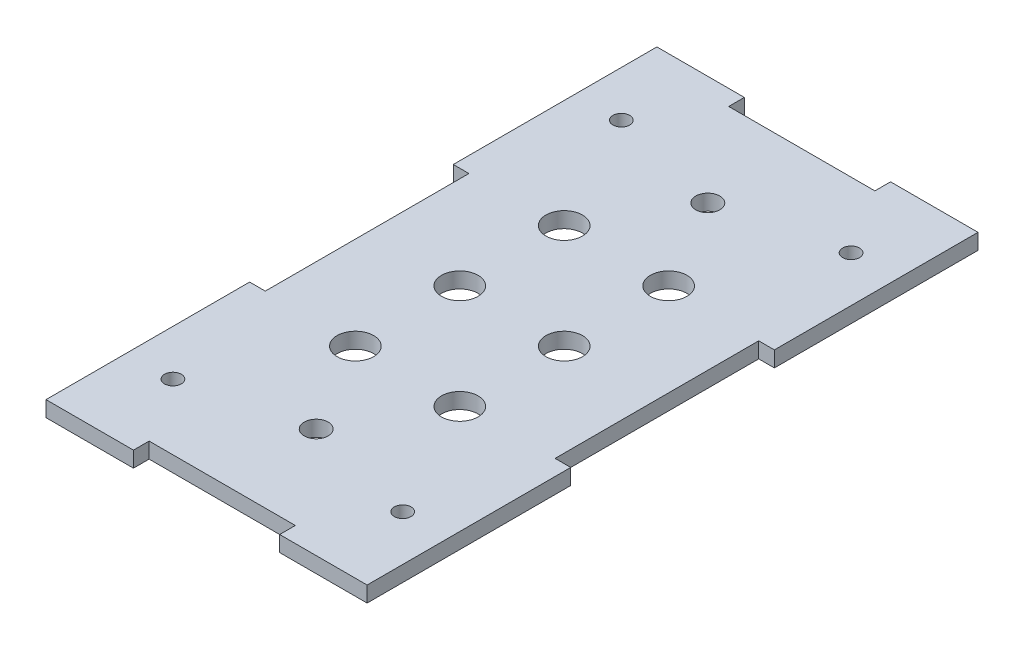
ISO-10303-21;
HEADER;
FILE_DESCRIPTION(('STEP AP214'),'2;1');
FILE_NAME('part.step','',(''),(''),'','','');
FILE_SCHEMA(('AUTOMOTIVE_DESIGN { 1 0 10303 214 1 1 1 1 }'));
ENDSEC;
DATA;
#1=APPLICATION_CONTEXT('core data for automotive mechanical design processes');
#2=APPLICATION_PROTOCOL_DEFINITION('international standard','automotive_design',2000,#1);
#3=PRODUCT_CONTEXT('',#1,'mechanical');
#4=PRODUCT('Part','Part','',(#3));
#5=PRODUCT_RELATED_PRODUCT_CATEGORY('part','',(#4));
#6=PRODUCT_DEFINITION_FORMATION('','',#4);
#7=PRODUCT_DEFINITION_CONTEXT('part definition',#1,'design');
#8=PRODUCT_DEFINITION('design','',#6,#7);
#9=PRODUCT_DEFINITION_SHAPE('','',#8);
#10=(LENGTH_UNIT() NAMED_UNIT(*) SI_UNIT(.MILLI.,.METRE.));
#11=(NAMED_UNIT(*) PLANE_ANGLE_UNIT() SI_UNIT($,.RADIAN.));
#12=(NAMED_UNIT(*) SI_UNIT($,.STERADIAN.) SOLID_ANGLE_UNIT());
#13=UNCERTAINTY_MEASURE_WITH_UNIT(LENGTH_MEASURE(1.E-05),#10,'distance_accuracy_value','');
#14=(GEOMETRIC_REPRESENTATION_CONTEXT(3) GLOBAL_UNCERTAINTY_ASSIGNED_CONTEXT((#13)) GLOBAL_UNIT_ASSIGNED_CONTEXT((#10,
#11,#12)) REPRESENTATION_CONTEXT('',''));
#15=CARTESIAN_POINT('',(0.,0.,0.));
#16=DIRECTION('',(0.,0.,1.));
#17=DIRECTION('',(1.,0.,0.));
#18=AXIS2_PLACEMENT_3D('',#15,#16,#17);
#19=CARTESIAN_POINT('',(0.,3.,0.));
#20=DIRECTION('',(0.,1.,0.));
#21=DIRECTION('',(0.,0.,1.));
#22=AXIS2_PLACEMENT_3D('',#19,#20,#21);
#23=PLANE('',#22);
#24=CARTESIAN_POINT('',(-10.0000000000001,3.,-20.));
#25=DIRECTION('',(0.,1.,0.));
#26=DIRECTION('',(0.,0.,1.));
#27=AXIS2_PLACEMENT_3D('',#24,#25,#26);
#28=CIRCLE('',#27,3.5);
#29=CARTESIAN_POINT('',(-10.0000000000001,3.,-16.5));
#30=VERTEX_POINT('',#29);
#31=EDGE_CURVE('E427',#30,#30,#28,.T.);
#32=ORIENTED_EDGE('',*,*,#31,.F.);
#33=EDGE_LOOP('',(#32));
#34=FACE_BOUND('',#33,.T.);
#35=CARTESIAN_POINT('',(-10.,3.,0.));
#36=DIRECTION('',(0.,1.,0.));
#37=DIRECTION('',(0.,0.,1.));
#38=AXIS2_PLACEMENT_3D('',#35,#36,#37);
#39=CIRCLE('',#38,3.5);
#40=CARTESIAN_POINT('',(-10.,3.,3.5));
#41=VERTEX_POINT('',#40);
#42=EDGE_CURVE('E439',#41,#41,#39,.T.);
#43=ORIENTED_EDGE('',*,*,#42,.F.);
#44=EDGE_LOOP('',(#43));
#45=FACE_BOUND('',#44,.T.);
#46=CARTESIAN_POINT('',(-9.99999999999979,3.,20.));
#47=DIRECTION('',(0.,1.,0.));
#48=DIRECTION('',(0.,0.,1.));
#49=AXIS2_PLACEMENT_3D('',#46,#47,#48);
#50=CIRCLE('',#49,3.5);
#51=CARTESIAN_POINT('',(-9.99999999999979,3.,23.5));
#52=VERTEX_POINT('',#51);
#53=EDGE_CURVE('E451',#52,#52,#50,.T.);
#54=ORIENTED_EDGE('',*,*,#53,.F.);
#55=EDGE_LOOP('',(#54));
#56=FACE_BOUND('',#55,.T.);
#57=CARTESIAN_POINT('',(22.,3.,-42.94));
#58=DIRECTION('',(0.,1.,0.));
#59=DIRECTION('',(0.,0.,1.));
#60=AXIS2_PLACEMENT_3D('',#57,#58,#59);
#61=CIRCLE('',#60,1.60920482237498);
#62=CARTESIAN_POINT('',(22.,3.,-41.330795177625));
#63=VERTEX_POINT('',#62);
#64=EDGE_CURVE('E463',#63,#63,#61,.T.);
#65=ORIENTED_EDGE('',*,*,#64,.F.);
#66=EDGE_LOOP('',(#65));
#67=FACE_BOUND('',#66,.T.);
#68=CARTESIAN_POINT('',(-22.,3.,42.94));
#69=DIRECTION('',(0.,1.,0.));
#70=DIRECTION('',(0.,0.,1.));
#71=AXIS2_PLACEMENT_3D('',#68,#69,#70);
#72=CIRCLE('',#71,1.60920482237498);
#73=CARTESIAN_POINT('',(-22.,3.,44.549204822375));
#74=VERTEX_POINT('',#73);
#75=EDGE_CURVE('E475',#74,#74,#72,.T.);
#76=ORIENTED_EDGE('',*,*,#75,.F.);
#77=EDGE_LOOP('',(#76));
#78=FACE_BOUND('',#77,.T.);
#79=CARTESIAN_POINT('',(0.,3.,-37.5));
#80=DIRECTION('',(0.,1.,0.));
#81=DIRECTION('',(0.,0.,1.));
#82=AXIS2_PLACEMENT_3D('',#79,#80,#81);
#83=CIRCLE('',#82,2.3);
#84=CARTESIAN_POINT('',(0.,3.,-35.2));
#85=VERTEX_POINT('',#84);
#86=EDGE_CURVE('E206',#85,#85,#83,.T.);
#87=ORIENTED_EDGE('',*,*,#86,.F.);
#88=EDGE_LOOP('',(#87));
#89=FACE_BOUND('',#88,.T.);
#90=DIRECTION('',(-1.,0.,0.));
#91=VECTOR('',#90,1.);
#92=CARTESIAN_POINT('',(30.7499999999994,3.,-58.5000000000003));
#93=LINE('',#92,#91);
#94=CARTESIAN_POINT('',(30.7499999999994,3.,-58.5000000000003));
#95=VERTEX_POINT('',#94);
#96=CARTESIAN_POINT('',(13.9999999999994,3.,-58.5000000000001));
#97=VERTEX_POINT('',#96);
#98=EDGE_CURVE('E241',#95,#97,#93,.T.);
#99=ORIENTED_EDGE('',*,*,#98,.T.);
#100=DIRECTION('',(0.,0.,1.));
#101=VECTOR('',#100,1.);
#102=CARTESIAN_POINT('',(13.9999999999994,3.,-58.5000000000001));
#103=LINE('',#102,#101);
#104=CARTESIAN_POINT('',(13.9999999999994,3.,-55.5000000000001));
#105=VERTEX_POINT('',#104);
#106=EDGE_CURVE('E129',#97,#105,#103,.T.);
#107=ORIENTED_EDGE('',*,*,#106,.T.);
#108=DIRECTION('',(-1.,0.,0.));
#109=VECTOR('',#108,1.);
#110=CARTESIAN_POINT('',(13.9999999999994,3.,-55.5000000000001));
#111=LINE('',#110,#109);
#112=CARTESIAN_POINT('',(-14.0000000000006,3.,-55.4999999999999));
#113=VERTEX_POINT('',#112);
#114=EDGE_CURVE('E292',#105,#113,#111,.T.);
#115=ORIENTED_EDGE('',*,*,#114,.T.);
#116=DIRECTION('',(0.,0.,-1.));
#117=VECTOR('',#116,1.);
#118=CARTESIAN_POINT('',(-14.0000000000006,3.,-55.4999999999999));
#119=LINE('',#118,#117);
#120=CARTESIAN_POINT('',(-14.0000000000006,3.,-58.4999999999999));
#121=VERTEX_POINT('',#120);
#122=EDGE_CURVE('E311',#113,#121,#119,.T.);
#123=ORIENTED_EDGE('',*,*,#122,.T.);
#124=DIRECTION('',(-1.,0.,0.));
#125=VECTOR('',#124,1.);
#126=CARTESIAN_POINT('',(-14.0000000000006,3.,-58.4999999999999));
#127=LINE('',#126,#125);
#128=CARTESIAN_POINT('',(-30.7500000000006,3.,-58.4999999999997));
#129=VERTEX_POINT('',#128);
#130=EDGE_CURVE('E308',#121,#129,#127,.T.);
#131=ORIENTED_EDGE('',*,*,#130,.T.);
#132=DIRECTION('',(0.,0.,1.));
#133=VECTOR('',#132,1.);
#134=CARTESIAN_POINT('',(-30.7500000000006,3.,-58.4999999999997));
#135=LINE('',#134,#133);
#136=CARTESIAN_POINT('',(-30.75,3.,-19.5));
#137=VERTEX_POINT('',#136);
#138=EDGE_CURVE('E310',#129,#137,#135,.T.);
#139=ORIENTED_EDGE('',*,*,#138,.T.);
#140=DIRECTION('',(1.,0.,0.));
#141=VECTOR('',#140,1.);
#142=CARTESIAN_POINT('',(-30.75,3.,-19.5));
#143=LINE('',#142,#141);
#144=CARTESIAN_POINT('',(-27.75,3.,-19.5));
#145=VERTEX_POINT('',#144);
#146=EDGE_CURVE('E313',#137,#145,#143,.T.);
#147=ORIENTED_EDGE('',*,*,#146,.T.);
#148=DIRECTION('',(0.,0.,1.));
#149=VECTOR('',#148,1.);
#150=CARTESIAN_POINT('',(-27.75,3.,-19.5));
#151=LINE('',#150,#149);
#152=CARTESIAN_POINT('',(-27.75,3.,19.5));
#153=VERTEX_POINT('',#152);
#154=EDGE_CURVE('E319',#145,#153,#151,.T.);
#155=ORIENTED_EDGE('',*,*,#154,.T.);
#156=DIRECTION('',(-1.,0.,0.));
#157=VECTOR('',#156,1.);
#158=CARTESIAN_POINT('',(-27.75,3.,19.5));
#159=LINE('',#158,#157);
#160=CARTESIAN_POINT('',(-30.75,3.,19.5));
#161=VERTEX_POINT('',#160);
#162=EDGE_CURVE('E321',#153,#161,#159,.T.);
#163=ORIENTED_EDGE('',*,*,#162,.T.);
#164=DIRECTION('',(0.,0.,1.));
#165=VECTOR('',#164,1.);
#166=CARTESIAN_POINT('',(-30.75,3.,19.5));
#167=LINE('',#166,#165);
#168=CARTESIAN_POINT('',(-30.7499999999994,3.,58.5000000000003));
#169=VERTEX_POINT('',#168);
#170=EDGE_CURVE('E323',#161,#169,#167,.T.);
#171=ORIENTED_EDGE('',*,*,#170,.T.);
#172=DIRECTION('',(1.,0.,0.));
#173=VECTOR('',#172,1.);
#174=CARTESIAN_POINT('',(-30.7499999999994,3.,58.5000000000003));
#175=LINE('',#174,#173);
#176=CARTESIAN_POINT('',(-14.,3.,58.5));
#177=VERTEX_POINT('',#176);
#178=EDGE_CURVE('E325',#169,#177,#175,.T.);
#179=ORIENTED_EDGE('',*,*,#178,.T.);
#180=DIRECTION('',(0.,0.,-1.));
#181=VECTOR('',#180,1.);
#182=CARTESIAN_POINT('',(-14.,3.,58.5));
#183=LINE('',#182,#181);
#184=CARTESIAN_POINT('',(-14.,3.,55.5));
#185=VERTEX_POINT('',#184);
#186=EDGE_CURVE('E327',#177,#185,#183,.T.);
#187=ORIENTED_EDGE('',*,*,#186,.T.);
#188=DIRECTION('',(1.,0.,0.));
#189=VECTOR('',#188,1.);
#190=CARTESIAN_POINT('',(-14.,3.,55.5));
#191=LINE('',#190,#189);
#192=CARTESIAN_POINT('',(14.,3.,55.5));
#193=VERTEX_POINT('',#192);
#194=EDGE_CURVE('E329',#185,#193,#191,.T.);
#195=ORIENTED_EDGE('',*,*,#194,.T.);
#196=DIRECTION('',(0.,0.,1.));
#197=VECTOR('',#196,1.);
#198=CARTESIAN_POINT('',(14.,3.,55.5));
#199=LINE('',#198,#197);
#200=CARTESIAN_POINT('',(14.,3.,58.5));
#201=VERTEX_POINT('',#200);
#202=EDGE_CURVE('E331',#193,#201,#199,.T.);
#203=ORIENTED_EDGE('',*,*,#202,.T.);
#204=DIRECTION('',(1.,0.,0.));
#205=VECTOR('',#204,1.);
#206=CARTESIAN_POINT('',(14.,3.,58.5));
#207=LINE('',#206,#205);
#208=CARTESIAN_POINT('',(30.7500000000006,3.,58.4999999999997));
#209=VERTEX_POINT('',#208);
#210=EDGE_CURVE('E333',#201,#209,#207,.T.);
#211=ORIENTED_EDGE('',*,*,#210,.T.);
#212=DIRECTION('',(0.,0.,-1.));
#213=VECTOR('',#212,1.);
#214=CARTESIAN_POINT('',(30.7500000000006,3.,58.4999999999997));
#215=LINE('',#214,#213);
#216=CARTESIAN_POINT('',(30.7500000000002,3.,19.4999999999997));
#217=VERTEX_POINT('',#216);
#218=EDGE_CURVE('E335',#209,#217,#215,.T.);
#219=ORIENTED_EDGE('',*,*,#218,.T.);
#220=DIRECTION('',(-1.,0.,0.));
#221=VECTOR('',#220,1.);
#222=CARTESIAN_POINT('',(30.7500000000002,3.,19.4999999999997));
#223=LINE('',#222,#221);
#224=CARTESIAN_POINT('',(27.7500000000002,3.,19.4999999999997));
#225=VERTEX_POINT('',#224);
#226=EDGE_CURVE('E184',#217,#225,#223,.T.);
#227=ORIENTED_EDGE('',*,*,#226,.T.);
#228=DIRECTION('',(0.,0.,-1.));
#229=VECTOR('',#228,1.);
#230=CARTESIAN_POINT('',(27.7500000000002,3.,19.4999999999997));
#231=LINE('',#230,#229);
#232=CARTESIAN_POINT('',(27.7499999999998,3.,-19.5000000000003));
#233=VERTEX_POINT('',#232);
#234=EDGE_CURVE('E178',#225,#233,#231,.T.);
#235=ORIENTED_EDGE('',*,*,#234,.T.);
#236=DIRECTION('',(1.,0.,0.));
#237=VECTOR('',#236,1.);
#238=CARTESIAN_POINT('',(27.7499999999998,3.,-19.5000000000003));
#239=LINE('',#238,#237);
#240=CARTESIAN_POINT('',(30.7499999999998,3.,-19.5000000000003));
#241=VERTEX_POINT('',#240);
#242=EDGE_CURVE('E182',#233,#241,#239,.T.);
#243=ORIENTED_EDGE('',*,*,#242,.T.);
#244=DIRECTION('',(0.,0.,-1.));
#245=VECTOR('',#244,1.);
#246=CARTESIAN_POINT('',(30.7499999999998,3.,-19.5000000000003));
#247=LINE('',#246,#245);
#248=EDGE_CURVE('E50',#241,#95,#247,.T.);
#249=ORIENTED_EDGE('',*,*,#248,.T.);
#250=EDGE_LOOP('',(#99,#107,#115,#123,#131,#139,#147,#155,#163,#171,#179,#187,#195,#203,#211,
#219,#227,#235,#243,#249));
#251=FACE_BOUND('',#250,.T.);
#252=CARTESIAN_POINT('',(0.,3.,37.5));
#253=DIRECTION('',(0.,1.,0.));
#254=DIRECTION('',(0.,0.,1.));
#255=AXIS2_PLACEMENT_3D('',#252,#253,#254);
#256=CIRCLE('',#255,2.3);
#257=CARTESIAN_POINT('',(0.,3.,39.8));
#258=VERTEX_POINT('',#257);
#259=EDGE_CURVE('E481',#258,#258,#256,.T.);
#260=ORIENTED_EDGE('',*,*,#259,.F.);
#261=EDGE_LOOP('',(#260));
#262=FACE_BOUND('',#261,.T.);
#263=CARTESIAN_POINT('',(22.,3.,42.94));
#264=DIRECTION('',(0.,1.,0.));
#265=DIRECTION('',(0.,0.,1.));
#266=AXIS2_PLACEMENT_3D('',#263,#264,#265);
#267=CIRCLE('',#266,1.60920482237498);
#268=CARTESIAN_POINT('',(22.,3.,44.549204822375));
#269=VERTEX_POINT('',#268);
#270=EDGE_CURVE('E469',#269,#269,#267,.T.);
#271=ORIENTED_EDGE('',*,*,#270,.F.);
#272=EDGE_LOOP('',(#271));
#273=FACE_BOUND('',#272,.T.);
#274=CARTESIAN_POINT('',(-22.,3.,-42.94));
#275=DIRECTION('',(0.,1.,0.));
#276=DIRECTION('',(0.,0.,1.));
#277=AXIS2_PLACEMENT_3D('',#274,#275,#276);
#278=CIRCLE('',#277,1.60920482237498);
#279=CARTESIAN_POINT('',(-22.,3.,-41.330795177625));
#280=VERTEX_POINT('',#279);
#281=EDGE_CURVE('E457',#280,#280,#278,.T.);
#282=ORIENTED_EDGE('',*,*,#281,.F.);
#283=EDGE_LOOP('',(#282));
#284=FACE_BOUND('',#283,.T.);
#285=CARTESIAN_POINT('',(10.0000000000002,3.,20.));
#286=DIRECTION('',(0.,1.,0.));
#287=DIRECTION('',(0.,0.,1.));
#288=AXIS2_PLACEMENT_3D('',#285,#286,#287);
#289=CIRCLE('',#288,3.5);
#290=CARTESIAN_POINT('',(10.0000000000002,3.,23.5));
#291=VERTEX_POINT('',#290);
#292=EDGE_CURVE('E445',#291,#291,#289,.T.);
#293=ORIENTED_EDGE('',*,*,#292,.F.);
#294=EDGE_LOOP('',(#293));
#295=FACE_BOUND('',#294,.T.);
#296=CARTESIAN_POINT('',(10.,3.,0.));
#297=DIRECTION('',(0.,1.,0.));
#298=DIRECTION('',(0.,0.,1.));
#299=AXIS2_PLACEMENT_3D('',#296,#297,#298);
#300=CIRCLE('',#299,3.5);
#301=CARTESIAN_POINT('',(10.,3.,3.5));
#302=VERTEX_POINT('',#301);
#303=EDGE_CURVE('E433',#302,#302,#300,.T.);
#304=ORIENTED_EDGE('',*,*,#303,.F.);
#305=EDGE_LOOP('',(#304));
#306=FACE_BOUND('',#305,.T.);
#307=CARTESIAN_POINT('',(9.99999999999993,3.,-20.));
#308=DIRECTION('',(0.,1.,0.));
#309=DIRECTION('',(0.,0.,1.));
#310=AXIS2_PLACEMENT_3D('',#307,#308,#309);
#311=CIRCLE('',#310,3.5);
#312=CARTESIAN_POINT('',(9.99999999999993,3.,-16.5));
#313=VERTEX_POINT('',#312);
#314=EDGE_CURVE('E418',#313,#313,#311,.T.);
#315=ORIENTED_EDGE('',*,*,#314,.F.);
#316=EDGE_LOOP('',(#315));
#317=FACE_BOUND('',#316,.T.);
#318=ADVANCED_FACE('F33',(#34,#45,#56,#67,#78,#89,#251,#262,#273,#284,#295,#306,#317),#23,.T.);
#319=CARTESIAN_POINT('',(0.,0.,0.));
#320=DIRECTION('',(0.,1.,0.));
#321=DIRECTION('',(0.,0.,1.));
#322=AXIS2_PLACEMENT_3D('',#319,#320,#321);
#323=PLANE('',#322);
#324=DIRECTION('',(-1.,0.,0.));
#325=VECTOR('',#324,1.);
#326=CARTESIAN_POINT('',(30.7499999999994,0.,-58.5000000000003));
#327=LINE('',#326,#325);
#328=CARTESIAN_POINT('',(30.7499999999994,0.,-58.5000000000003));
#329=VERTEX_POINT('',#328);
#330=CARTESIAN_POINT('',(13.9999999999994,0.,-58.5000000000001));
#331=VERTEX_POINT('',#330);
#332=EDGE_CURVE('E202',#329,#331,#327,.T.);
#333=ORIENTED_EDGE('',*,*,#332,.F.);
#334=DIRECTION('',(0.,0.,-1.));
#335=VECTOR('',#334,1.);
#336=CARTESIAN_POINT('',(30.7499999999998,0.,-19.5000000000003));
#337=LINE('',#336,#335);
#338=CARTESIAN_POINT('',(30.7499999999998,0.,-19.5000000000003));
#339=VERTEX_POINT('',#338);
#340=EDGE_CURVE('E121',#339,#329,#337,.T.);
#341=ORIENTED_EDGE('',*,*,#340,.F.);
#342=DIRECTION('',(1.,0.,0.));
#343=VECTOR('',#342,1.);
#344=CARTESIAN_POINT('',(27.7499999999998,0.,-19.5000000000003));
#345=LINE('',#344,#343);
#346=CARTESIAN_POINT('',(27.7499999999998,0.,-19.5000000000003));
#347=VERTEX_POINT('',#346);
#348=EDGE_CURVE('E115',#347,#339,#345,.T.);
#349=ORIENTED_EDGE('',*,*,#348,.F.);
#350=DIRECTION('',(0.,0.,-1.));
#351=VECTOR('',#350,1.);
#352=CARTESIAN_POINT('',(27.7500000000002,0.,19.4999999999997));
#353=LINE('',#352,#351);
#354=CARTESIAN_POINT('',(27.7500000000002,0.,19.4999999999997));
#355=VERTEX_POINT('',#354);
#356=EDGE_CURVE('E192',#355,#347,#353,.T.);
#357=ORIENTED_EDGE('',*,*,#356,.F.);
#358=DIRECTION('',(-1.,0.,0.));
#359=VECTOR('',#358,1.);
#360=CARTESIAN_POINT('',(30.7500000000002,0.,19.4999999999997));
#361=LINE('',#360,#359);
#362=CARTESIAN_POINT('',(30.7500000000002,0.,19.4999999999997));
#363=VERTEX_POINT('',#362);
#364=EDGE_CURVE('E236',#363,#355,#361,.T.);
#365=ORIENTED_EDGE('',*,*,#364,.F.);
#366=DIRECTION('',(0.,0.,-1.));
#367=VECTOR('',#366,1.);
#368=CARTESIAN_POINT('',(30.7500000000006,0.,58.4999999999997));
#369=LINE('',#368,#367);
#370=CARTESIAN_POINT('',(30.7500000000006,0.,58.4999999999997));
#371=VERTEX_POINT('',#370);
#372=EDGE_CURVE('E234',#371,#363,#369,.T.);
#373=ORIENTED_EDGE('',*,*,#372,.F.);
#374=DIRECTION('',(1.,0.,0.));
#375=VECTOR('',#374,1.);
#376=CARTESIAN_POINT('',(14.,0.,58.5));
#377=LINE('',#376,#375);
#378=CARTESIAN_POINT('',(14.,0.,58.5));
#379=VERTEX_POINT('',#378);
#380=EDGE_CURVE('E232',#379,#371,#377,.T.);
#381=ORIENTED_EDGE('',*,*,#380,.F.);
#382=DIRECTION('',(0.,0.,1.));
#383=VECTOR('',#382,1.);
#384=CARTESIAN_POINT('',(14.,0.,55.5));
#385=LINE('',#384,#383);
#386=CARTESIAN_POINT('',(14.,0.,55.5));
#387=VERTEX_POINT('',#386);
#388=EDGE_CURVE('E230',#387,#379,#385,.T.);
#389=ORIENTED_EDGE('',*,*,#388,.F.);
#390=DIRECTION('',(1.,0.,0.));
#391=VECTOR('',#390,1.);
#392=CARTESIAN_POINT('',(-14.,0.,55.5));
#393=LINE('',#392,#391);
#394=CARTESIAN_POINT('',(-14.,0.,55.5));
#395=VERTEX_POINT('',#394);
#396=EDGE_CURVE('E228',#395,#387,#393,.T.);
#397=ORIENTED_EDGE('',*,*,#396,.F.);
#398=DIRECTION('',(0.,0.,-1.));
#399=VECTOR('',#398,1.);
#400=CARTESIAN_POINT('',(-14.,0.,58.5));
#401=LINE('',#400,#399);
#402=CARTESIAN_POINT('',(-14.,0.,58.5));
#403=VERTEX_POINT('',#402);
#404=EDGE_CURVE('E226',#403,#395,#401,.T.);
#405=ORIENTED_EDGE('',*,*,#404,.F.);
#406=DIRECTION('',(1.,0.,0.));
#407=VECTOR('',#406,1.);
#408=CARTESIAN_POINT('',(-30.7499999999994,0.,58.5000000000003));
#409=LINE('',#408,#407);
#410=CARTESIAN_POINT('',(-30.7499999999994,0.,58.5000000000003));
#411=VERTEX_POINT('',#410);
#412=EDGE_CURVE('E224',#411,#403,#409,.T.);
#413=ORIENTED_EDGE('',*,*,#412,.F.);
#414=DIRECTION('',(0.,0.,1.));
#415=VECTOR('',#414,1.);
#416=CARTESIAN_POINT('',(-30.75,0.,19.5));
#417=LINE('',#416,#415);
#418=CARTESIAN_POINT('',(-30.75,0.,19.5));
#419=VERTEX_POINT('',#418);
#420=EDGE_CURVE('E222',#419,#411,#417,.T.);
#421=ORIENTED_EDGE('',*,*,#420,.F.);
#422=DIRECTION('',(-1.,0.,0.));
#423=VECTOR('',#422,1.);
#424=CARTESIAN_POINT('',(-27.75,0.,19.5));
#425=LINE('',#424,#423);
#426=CARTESIAN_POINT('',(-27.75,0.,19.5));
#427=VERTEX_POINT('',#426);
#428=EDGE_CURVE('E220',#427,#419,#425,.T.);
#429=ORIENTED_EDGE('',*,*,#428,.F.);
#430=DIRECTION('',(0.,0.,1.));
#431=VECTOR('',#430,1.);
#432=CARTESIAN_POINT('',(-27.75,0.,-19.5));
#433=LINE('',#432,#431);
#434=CARTESIAN_POINT('',(-27.75,0.,-19.5));
#435=VERTEX_POINT('',#434);
#436=EDGE_CURVE('E218',#435,#427,#433,.T.);
#437=ORIENTED_EDGE('',*,*,#436,.F.);
#438=DIRECTION('',(1.,0.,0.));
#439=VECTOR('',#438,1.);
#440=CARTESIAN_POINT('',(-30.75,0.,-19.5));
#441=LINE('',#440,#439);
#442=CARTESIAN_POINT('',(-30.75,0.,-19.5));
#443=VERTEX_POINT('',#442);
#444=EDGE_CURVE('E216',#443,#435,#441,.T.);
#445=ORIENTED_EDGE('',*,*,#444,.F.);
#446=DIRECTION('',(0.,0.,1.));
#447=VECTOR('',#446,1.);
#448=CARTESIAN_POINT('',(-30.7500000000006,0.,-58.4999999999997));
#449=LINE('',#448,#447);
#450=CARTESIAN_POINT('',(-30.7500000000006,0.,-58.4999999999997));
#451=VERTEX_POINT('',#450);
#452=EDGE_CURVE('E214',#451,#443,#449,.T.);
#453=ORIENTED_EDGE('',*,*,#452,.F.);
#454=DIRECTION('',(-1.,0.,0.));
#455=VECTOR('',#454,1.);
#456=CARTESIAN_POINT('',(-14.0000000000006,0.,-58.4999999999999));
#457=LINE('',#456,#455);
#458=CARTESIAN_POINT('',(-14.0000000000006,0.,-58.4999999999999));
#459=VERTEX_POINT('',#458);
#460=EDGE_CURVE('E212',#459,#451,#457,.T.);
#461=ORIENTED_EDGE('',*,*,#460,.F.);
#462=DIRECTION('',(0.,0.,-1.));
#463=VECTOR('',#462,1.);
#464=CARTESIAN_POINT('',(-14.0000000000006,0.,-55.4999999999999));
#465=LINE('',#464,#463);
#466=CARTESIAN_POINT('',(-14.0000000000006,0.,-55.4999999999999));
#467=VERTEX_POINT('',#466);
#468=EDGE_CURVE('E210',#467,#459,#465,.T.);
#469=ORIENTED_EDGE('',*,*,#468,.F.);
#470=DIRECTION('',(-1.,0.,0.));
#471=VECTOR('',#470,1.);
#472=CARTESIAN_POINT('',(13.9999999999994,0.,-55.5000000000001));
#473=LINE('',#472,#471);
#474=CARTESIAN_POINT('',(13.9999999999994,0.,-55.5000000000001));
#475=VERTEX_POINT('',#474);
#476=EDGE_CURVE('E208',#475,#467,#473,.T.);
#477=ORIENTED_EDGE('',*,*,#476,.F.);
#478=DIRECTION('',(0.,0.,1.));
#479=VECTOR('',#478,1.);
#480=CARTESIAN_POINT('',(13.9999999999994,0.,-58.5000000000001));
#481=LINE('',#480,#479);
#482=EDGE_CURVE('E205',#331,#475,#481,.T.);
#483=ORIENTED_EDGE('',*,*,#482,.F.);
#484=EDGE_LOOP('',(#333,#341,#349,#357,#365,#373,#381,#389,#397,#405,#413,#421,#429,#437,#445,
#453,#461,#469,#477,#483));
#485=FACE_BOUND('',#484,.T.);
#486=CARTESIAN_POINT('',(0.,0.,-37.5));
#487=DIRECTION('',(0.,1.,0.));
#488=DIRECTION('',(0.,0.,1.));
#489=AXIS2_PLACEMENT_3D('',#486,#487,#488);
#490=CIRCLE('',#489,2.3);
#491=CARTESIAN_POINT('',(0.,0.,-35.2));
#492=VERTEX_POINT('',#491);
#493=EDGE_CURVE('E484',#492,#492,#490,.T.);
#494=ORIENTED_EDGE('',*,*,#493,.T.);
#495=EDGE_LOOP('',(#494));
#496=FACE_BOUND('',#495,.T.);
#497=CARTESIAN_POINT('',(0.,0.,37.5));
#498=DIRECTION('',(0.,1.,0.));
#499=DIRECTION('',(0.,0.,1.));
#500=AXIS2_PLACEMENT_3D('',#497,#498,#499);
#501=CIRCLE('',#500,2.3);
#502=CARTESIAN_POINT('',(0.,0.,39.8));
#503=VERTEX_POINT('',#502);
#504=EDGE_CURVE('E478',#503,#503,#501,.T.);
#505=ORIENTED_EDGE('',*,*,#504,.T.);
#506=EDGE_LOOP('',(#505));
#507=FACE_BOUND('',#506,.T.);
#508=CARTESIAN_POINT('',(-22.,0.,42.94));
#509=DIRECTION('',(0.,1.,0.));
#510=DIRECTION('',(0.,0.,1.));
#511=AXIS2_PLACEMENT_3D('',#508,#509,#510);
#512=CIRCLE('',#511,1.60920482237498);
#513=CARTESIAN_POINT('',(-22.,0.,44.549204822375));
#514=VERTEX_POINT('',#513);
#515=EDGE_CURVE('E472',#514,#514,#512,.T.);
#516=ORIENTED_EDGE('',*,*,#515,.T.);
#517=EDGE_LOOP('',(#516));
#518=FACE_BOUND('',#517,.T.);
#519=CARTESIAN_POINT('',(22.,0.,42.94));
#520=DIRECTION('',(0.,1.,0.));
#521=DIRECTION('',(0.,0.,1.));
#522=AXIS2_PLACEMENT_3D('',#519,#520,#521);
#523=CIRCLE('',#522,1.60920482237498);
#524=CARTESIAN_POINT('',(22.,0.,44.549204822375));
#525=VERTEX_POINT('',#524);
#526=EDGE_CURVE('E466',#525,#525,#523,.T.);
#527=ORIENTED_EDGE('',*,*,#526,.T.);
#528=EDGE_LOOP('',(#527));
#529=FACE_BOUND('',#528,.T.);
#530=CARTESIAN_POINT('',(22.,0.,-42.94));
#531=DIRECTION('',(0.,1.,0.));
#532=DIRECTION('',(0.,0.,1.));
#533=AXIS2_PLACEMENT_3D('',#530,#531,#532);
#534=CIRCLE('',#533,1.60920482237498);
#535=CARTESIAN_POINT('',(22.,0.,-41.330795177625));
#536=VERTEX_POINT('',#535);
#537=EDGE_CURVE('E460',#536,#536,#534,.T.);
#538=ORIENTED_EDGE('',*,*,#537,.T.);
#539=EDGE_LOOP('',(#538));
#540=FACE_BOUND('',#539,.T.);
#541=CARTESIAN_POINT('',(-22.,0.,-42.94));
#542=DIRECTION('',(0.,1.,0.));
#543=DIRECTION('',(0.,0.,1.));
#544=AXIS2_PLACEMENT_3D('',#541,#542,#543);
#545=CIRCLE('',#544,1.60920482237498);
#546=CARTESIAN_POINT('',(-22.,0.,-41.330795177625));
#547=VERTEX_POINT('',#546);
#548=EDGE_CURVE('E454',#547,#547,#545,.T.);
#549=ORIENTED_EDGE('',*,*,#548,.T.);
#550=EDGE_LOOP('',(#549));
#551=FACE_BOUND('',#550,.T.);
#552=CARTESIAN_POINT('',(-9.99999999999979,0.,20.));
#553=DIRECTION('',(0.,1.,0.));
#554=DIRECTION('',(0.,0.,1.));
#555=AXIS2_PLACEMENT_3D('',#552,#553,#554);
#556=CIRCLE('',#555,3.5);
#557=CARTESIAN_POINT('',(-9.99999999999979,0.,23.5));
#558=VERTEX_POINT('',#557);
#559=EDGE_CURVE('E448',#558,#558,#556,.T.);
#560=ORIENTED_EDGE('',*,*,#559,.T.);
#561=EDGE_LOOP('',(#560));
#562=FACE_BOUND('',#561,.T.);
#563=CARTESIAN_POINT('',(10.0000000000002,0.,20.));
#564=DIRECTION('',(0.,1.,0.));
#565=DIRECTION('',(0.,0.,1.));
#566=AXIS2_PLACEMENT_3D('',#563,#564,#565);
#567=CIRCLE('',#566,3.5);
#568=CARTESIAN_POINT('',(10.0000000000002,0.,23.5));
#569=VERTEX_POINT('',#568);
#570=EDGE_CURVE('E442',#569,#569,#567,.T.);
#571=ORIENTED_EDGE('',*,*,#570,.T.);
#572=EDGE_LOOP('',(#571));
#573=FACE_BOUND('',#572,.T.);
#574=CARTESIAN_POINT('',(-10.,0.,0.));
#575=DIRECTION('',(0.,1.,0.));
#576=DIRECTION('',(0.,0.,1.));
#577=AXIS2_PLACEMENT_3D('',#574,#575,#576);
#578=CIRCLE('',#577,3.5);
#579=CARTESIAN_POINT('',(-10.,0.,3.5));
#580=VERTEX_POINT('',#579);
#581=EDGE_CURVE('E436',#580,#580,#578,.T.);
#582=ORIENTED_EDGE('',*,*,#581,.T.);
#583=EDGE_LOOP('',(#582));
#584=FACE_BOUND('',#583,.T.);
#585=CARTESIAN_POINT('',(10.,0.,0.));
#586=DIRECTION('',(0.,1.,0.));
#587=DIRECTION('',(0.,0.,1.));
#588=AXIS2_PLACEMENT_3D('',#585,#586,#587);
#589=CIRCLE('',#588,3.5);
#590=CARTESIAN_POINT('',(10.,0.,3.5));
#591=VERTEX_POINT('',#590);
#592=EDGE_CURVE('E430',#591,#591,#589,.T.);
#593=ORIENTED_EDGE('',*,*,#592,.T.);
#594=EDGE_LOOP('',(#593));
#595=FACE_BOUND('',#594,.T.);
#596=CARTESIAN_POINT('',(-10.0000000000001,0.,-20.));
#597=DIRECTION('',(0.,1.,0.));
#598=DIRECTION('',(0.,0.,1.));
#599=AXIS2_PLACEMENT_3D('',#596,#597,#598);
#600=CIRCLE('',#599,3.5);
#601=CARTESIAN_POINT('',(-10.0000000000001,0.,-16.5));
#602=VERTEX_POINT('',#601);
#603=EDGE_CURVE('E424',#602,#602,#600,.T.);
#604=ORIENTED_EDGE('',*,*,#603,.T.);
#605=EDGE_LOOP('',(#604));
#606=FACE_BOUND('',#605,.T.);
#607=CARTESIAN_POINT('',(9.99999999999993,0.,-20.));
#608=DIRECTION('',(0.,1.,0.));
#609=DIRECTION('',(0.,0.,1.));
#610=AXIS2_PLACEMENT_3D('',#607,#608,#609);
#611=CIRCLE('',#610,3.5);
#612=CARTESIAN_POINT('',(9.99999999999993,0.,-16.5));
#613=VERTEX_POINT('',#612);
#614=EDGE_CURVE('E421',#613,#613,#611,.T.);
#615=ORIENTED_EDGE('',*,*,#614,.T.);
#616=EDGE_LOOP('',(#615));
#617=FACE_BOUND('',#616,.T.);
#618=ADVANCED_FACE('F296',(#485,#496,#507,#518,#529,#540,#551,#562,#573,#584,#595,#606,#617),
#323,.F.);
#619=CARTESIAN_POINT('',(30.7499999999994,3.,-58.5000000000003));
#620=DIRECTION('',(0.,0.,1.));
#621=DIRECTION('',(1.,0.,0.));
#622=AXIS2_PLACEMENT_3D('',#619,#620,#621);
#623=PLANE('',#622);
#624=ORIENTED_EDGE('',*,*,#332,.T.);
#625=DIRECTION('',(0.,-1.,0.));
#626=VECTOR('',#625,1.);
#627=CARTESIAN_POINT('',(13.9999999999994,3.,-58.5000000000001));
#628=LINE('',#627,#626);
#629=EDGE_CURVE('E11',#97,#331,#628,.T.);
#630=ORIENTED_EDGE('',*,*,#629,.F.);
#631=ORIENTED_EDGE('',*,*,#98,.F.);
#632=DIRECTION('',(0.,-1.,0.));
#633=VECTOR('',#632,1.);
#634=CARTESIAN_POINT('',(30.7499999999994,3.,-58.5000000000003));
#635=LINE('',#634,#633);
#636=EDGE_CURVE('E198',#95,#329,#635,.T.);
#637=ORIENTED_EDGE('',*,*,#636,.T.);
#638=EDGE_LOOP('',(#624,#630,#631,#637));
#639=FACE_BOUND('',#638,.T.);
#640=ADVANCED_FACE('F35',(#639),#623,.F.);
#641=CARTESIAN_POINT('',(13.9999999999994,3.,-58.5000000000001));
#642=DIRECTION('',(1.,0.,0.));
#643=DIRECTION('',(0.,0.,-1.));
#644=AXIS2_PLACEMENT_3D('',#641,#642,#643);
#645=PLANE('',#644);
#646=ORIENTED_EDGE('',*,*,#482,.T.);
#647=DIRECTION('',(0.,-1.,0.));
#648=VECTOR('',#647,1.);
#649=CARTESIAN_POINT('',(13.9999999999994,3.,-55.5000000000001));
#650=LINE('',#649,#648);
#651=EDGE_CURVE('E42',#105,#475,#650,.T.);
#652=ORIENTED_EDGE('',*,*,#651,.F.);
#653=ORIENTED_EDGE('',*,*,#106,.F.);
#654=ORIENTED_EDGE('',*,*,#629,.T.);
#655=EDGE_LOOP('',(#646,#652,#653,#654));
#656=FACE_BOUND('',#655,.T.);
#657=ADVANCED_FACE('F746',(#656),#645,.F.);
#658=CARTESIAN_POINT('',(13.9999999999994,3.,-55.5000000000001));
#659=DIRECTION('',(0.,0.,1.));
#660=DIRECTION('',(1.,0.,0.));
#661=AXIS2_PLACEMENT_3D('',#658,#659,#660);
#662=PLANE('',#661);
#663=ORIENTED_EDGE('',*,*,#476,.T.);
#664=DIRECTION('',(0.,-1.,0.));
#665=VECTOR('',#664,1.);
#666=CARTESIAN_POINT('',(-14.0000000000006,3.,-55.4999999999999));
#667=LINE('',#666,#665);
#668=EDGE_CURVE('E284',#113,#467,#667,.T.);
#669=ORIENTED_EDGE('',*,*,#668,.F.);
#670=ORIENTED_EDGE('',*,*,#114,.F.);
#671=ORIENTED_EDGE('',*,*,#651,.T.);
#672=EDGE_LOOP('',(#663,#669,#670,#671));
#673=FACE_BOUND('',#672,.T.);
#674=ADVANCED_FACE('F290',(#673),#662,.F.);
#675=CARTESIAN_POINT('',(-14.0000000000006,3.,-55.4999999999999));
#676=DIRECTION('',(-1.,0.,0.));
#677=DIRECTION('',(0.,0.,1.));
#678=AXIS2_PLACEMENT_3D('',#675,#676,#677);
#679=PLANE('',#678);
#680=ORIENTED_EDGE('',*,*,#468,.T.);
#681=DIRECTION('',(0.,-1.,0.));
#682=VECTOR('',#681,1.);
#683=CARTESIAN_POINT('',(-14.0000000000006,3.,-58.4999999999999));
#684=LINE('',#683,#682);
#685=EDGE_CURVE('E281',#121,#459,#684,.T.);
#686=ORIENTED_EDGE('',*,*,#685,.F.);
#687=ORIENTED_EDGE('',*,*,#122,.F.);
#688=ORIENTED_EDGE('',*,*,#668,.T.);
#689=EDGE_LOOP('',(#680,#686,#687,#688));
#690=FACE_BOUND('',#689,.T.);
#691=ADVANCED_FACE('F302',(#690),#679,.F.);
#692=CARTESIAN_POINT('',(-14.0000000000006,3.,-58.4999999999999));
#693=DIRECTION('',(0.,0.,1.));
#694=DIRECTION('',(1.,0.,0.));
#695=AXIS2_PLACEMENT_3D('',#692,#693,#694);
#696=PLANE('',#695);
#697=ORIENTED_EDGE('',*,*,#460,.T.);
#698=DIRECTION('',(0.,-1.,0.));
#699=VECTOR('',#698,1.);
#700=CARTESIAN_POINT('',(-30.7500000000006,3.,-58.4999999999997));
#701=LINE('',#700,#699);
#702=EDGE_CURVE('E278',#129,#451,#701,.T.);
#703=ORIENTED_EDGE('',*,*,#702,.F.);
#704=ORIENTED_EDGE('',*,*,#130,.F.);
#705=ORIENTED_EDGE('',*,*,#685,.T.);
#706=EDGE_LOOP('',(#697,#703,#704,#705));
#707=FACE_BOUND('',#706,.T.);
#708=ADVANCED_FACE('F306',(#707),#696,.F.);
#709=CARTESIAN_POINT('',(-30.7500000000006,3.,-58.4999999999997));
#710=DIRECTION('',(1.,0.,0.));
#711=DIRECTION('',(0.,0.,-1.));
#712=AXIS2_PLACEMENT_3D('',#709,#710,#711);
#713=PLANE('',#712);
#714=ORIENTED_EDGE('',*,*,#452,.T.);
#715=DIRECTION('',(0.,-1.,0.));
#716=VECTOR('',#715,1.);
#717=CARTESIAN_POINT('',(-30.75,3.,-19.5));
#718=LINE('',#717,#716);
#719=EDGE_CURVE('E275',#137,#443,#718,.T.);
#720=ORIENTED_EDGE('',*,*,#719,.F.);
#721=ORIENTED_EDGE('',*,*,#138,.F.);
#722=ORIENTED_EDGE('',*,*,#702,.T.);
#723=EDGE_LOOP('',(#714,#720,#721,#722));
#724=FACE_BOUND('',#723,.T.);
#725=ADVANCED_FACE('F711',(#724),#713,.F.);
#726=CARTESIAN_POINT('',(-30.75,3.,-19.5));
#727=DIRECTION('',(0.,0.,-1.));
#728=DIRECTION('',(-1.,0.,0.));
#729=AXIS2_PLACEMENT_3D('',#726,#727,#728);
#730=PLANE('',#729);
#731=ORIENTED_EDGE('',*,*,#444,.T.);
#732=DIRECTION('',(0.,-1.,0.));
#733=VECTOR('',#732,1.);
#734=CARTESIAN_POINT('',(-27.75,3.,-19.5));
#735=LINE('',#734,#733);
#736=EDGE_CURVE('E272',#145,#435,#735,.T.);
#737=ORIENTED_EDGE('',*,*,#736,.F.);
#738=ORIENTED_EDGE('',*,*,#146,.F.);
#739=ORIENTED_EDGE('',*,*,#719,.T.);
#740=EDGE_LOOP('',(#731,#737,#738,#739));
#741=FACE_BOUND('',#740,.T.);
#742=ADVANCED_FACE('F701',(#741),#730,.F.);
#743=CARTESIAN_POINT('',(-27.75,3.,-19.5));
#744=DIRECTION('',(1.,0.,0.));
#745=DIRECTION('',(0.,0.,-1.));
#746=AXIS2_PLACEMENT_3D('',#743,#744,#745);
#747=PLANE('',#746);
#748=ORIENTED_EDGE('',*,*,#436,.T.);
#749=DIRECTION('',(0.,-1.,0.));
#750=VECTOR('',#749,1.);
#751=CARTESIAN_POINT('',(-27.75,3.,19.5));
#752=LINE('',#751,#750);
#753=EDGE_CURVE('E269',#153,#427,#752,.T.);
#754=ORIENTED_EDGE('',*,*,#753,.F.);
#755=ORIENTED_EDGE('',*,*,#154,.F.);
#756=ORIENTED_EDGE('',*,*,#736,.T.);
#757=EDGE_LOOP('',(#748,#754,#755,#756));
#758=FACE_BOUND('',#757,.T.);
#759=ADVANCED_FACE('F691',(#758),#747,.F.);
#760=CARTESIAN_POINT('',(-27.75,3.,19.5));
#761=DIRECTION('',(0.,0.,1.));
#762=DIRECTION('',(1.,0.,0.));
#763=AXIS2_PLACEMENT_3D('',#760,#761,#762);
#764=PLANE('',#763);
#765=ORIENTED_EDGE('',*,*,#428,.T.);
#766=DIRECTION('',(0.,-1.,0.));
#767=VECTOR('',#766,1.);
#768=CARTESIAN_POINT('',(-30.75,3.,19.5));
#769=LINE('',#768,#767);
#770=EDGE_CURVE('E266',#161,#419,#769,.T.);
#771=ORIENTED_EDGE('',*,*,#770,.F.);
#772=ORIENTED_EDGE('',*,*,#162,.F.);
#773=ORIENTED_EDGE('',*,*,#753,.T.);
#774=EDGE_LOOP('',(#765,#771,#772,#773));
#775=FACE_BOUND('',#774,.T.);
#776=ADVANCED_FACE('F681',(#775),#764,.F.);
#777=CARTESIAN_POINT('',(-30.75,3.,19.5));
#778=DIRECTION('',(1.,0.,0.));
#779=DIRECTION('',(0.,0.,-1.));
#780=AXIS2_PLACEMENT_3D('',#777,#778,#779);
#781=PLANE('',#780);
#782=ORIENTED_EDGE('',*,*,#420,.T.);
#783=DIRECTION('',(0.,-1.,0.));
#784=VECTOR('',#783,1.);
#785=CARTESIAN_POINT('',(-30.7499999999994,3.,58.5000000000003));
#786=LINE('',#785,#784);
#787=EDGE_CURVE('E263',#169,#411,#786,.T.);
#788=ORIENTED_EDGE('',*,*,#787,.F.);
#789=ORIENTED_EDGE('',*,*,#170,.F.);
#790=ORIENTED_EDGE('',*,*,#770,.T.);
#791=EDGE_LOOP('',(#782,#788,#789,#790));
#792=FACE_BOUND('',#791,.T.);
#793=ADVANCED_FACE('F671',(#792),#781,.F.);
#794=CARTESIAN_POINT('',(-30.7499999999994,3.,58.5000000000003));
#795=DIRECTION('',(0.,0.,-1.));
#796=DIRECTION('',(-1.,0.,0.));
#797=AXIS2_PLACEMENT_3D('',#794,#795,#796);
#798=PLANE('',#797);
#799=ORIENTED_EDGE('',*,*,#412,.T.);
#800=DIRECTION('',(0.,-1.,0.));
#801=VECTOR('',#800,1.);
#802=CARTESIAN_POINT('',(-14.,3.,58.5));
#803=LINE('',#802,#801);
#804=EDGE_CURVE('E260',#177,#403,#803,.T.);
#805=ORIENTED_EDGE('',*,*,#804,.F.);
#806=ORIENTED_EDGE('',*,*,#178,.F.);
#807=ORIENTED_EDGE('',*,*,#787,.T.);
#808=EDGE_LOOP('',(#799,#805,#806,#807));
#809=FACE_BOUND('',#808,.T.);
#810=ADVANCED_FACE('F661',(#809),#798,.F.);
#811=CARTESIAN_POINT('',(-14.,3.,58.5));
#812=DIRECTION('',(-1.,0.,0.));
#813=DIRECTION('',(0.,0.,1.));
#814=AXIS2_PLACEMENT_3D('',#811,#812,#813);
#815=PLANE('',#814);
#816=ORIENTED_EDGE('',*,*,#404,.T.);
#817=DIRECTION('',(0.,-1.,0.));
#818=VECTOR('',#817,1.);
#819=CARTESIAN_POINT('',(-14.,3.,55.5));
#820=LINE('',#819,#818);
#821=EDGE_CURVE('E257',#185,#395,#820,.T.);
#822=ORIENTED_EDGE('',*,*,#821,.F.);
#823=ORIENTED_EDGE('',*,*,#186,.F.);
#824=ORIENTED_EDGE('',*,*,#804,.T.);
#825=EDGE_LOOP('',(#816,#822,#823,#824));
#826=FACE_BOUND('',#825,.T.);
#827=ADVANCED_FACE('F651',(#826),#815,.F.);
#828=CARTESIAN_POINT('',(-14.,3.,55.5));
#829=DIRECTION('',(0.,0.,-1.));
#830=DIRECTION('',(-1.,0.,0.));
#831=AXIS2_PLACEMENT_3D('',#828,#829,#830);
#832=PLANE('',#831);
#833=ORIENTED_EDGE('',*,*,#396,.T.);
#834=DIRECTION('',(0.,-1.,0.));
#835=VECTOR('',#834,1.);
#836=CARTESIAN_POINT('',(14.,3.,55.5));
#837=LINE('',#836,#835);
#838=EDGE_CURVE('E254',#193,#387,#837,.T.);
#839=ORIENTED_EDGE('',*,*,#838,.F.);
#840=ORIENTED_EDGE('',*,*,#194,.F.);
#841=ORIENTED_EDGE('',*,*,#821,.T.);
#842=EDGE_LOOP('',(#833,#839,#840,#841));
#843=FACE_BOUND('',#842,.T.);
#844=ADVANCED_FACE('F641',(#843),#832,.F.);
#845=CARTESIAN_POINT('',(14.,3.,55.5));
#846=DIRECTION('',(1.,0.,0.));
#847=DIRECTION('',(0.,0.,-1.));
#848=AXIS2_PLACEMENT_3D('',#845,#846,#847);
#849=PLANE('',#848);
#850=ORIENTED_EDGE('',*,*,#388,.T.);
#851=DIRECTION('',(0.,-1.,0.));
#852=VECTOR('',#851,1.);
#853=CARTESIAN_POINT('',(14.,3.,58.5));
#854=LINE('',#853,#852);
#855=EDGE_CURVE('E251',#201,#379,#854,.T.);
#856=ORIENTED_EDGE('',*,*,#855,.F.);
#857=ORIENTED_EDGE('',*,*,#202,.F.);
#858=ORIENTED_EDGE('',*,*,#838,.T.);
#859=EDGE_LOOP('',(#850,#856,#857,#858));
#860=FACE_BOUND('',#859,.T.);
#861=ADVANCED_FACE('F631',(#860),#849,.F.);
#862=CARTESIAN_POINT('',(14.,3.,58.5));
#863=DIRECTION('',(0.,0.,-1.));
#864=DIRECTION('',(-1.,0.,0.));
#865=AXIS2_PLACEMENT_3D('',#862,#863,#864);
#866=PLANE('',#865);
#867=ORIENTED_EDGE('',*,*,#380,.T.);
#868=DIRECTION('',(0.,-1.,0.));
#869=VECTOR('',#868,1.);
#870=CARTESIAN_POINT('',(30.7500000000006,3.,58.4999999999997));
#871=LINE('',#870,#869);
#872=EDGE_CURVE('E248',#209,#371,#871,.T.);
#873=ORIENTED_EDGE('',*,*,#872,.F.);
#874=ORIENTED_EDGE('',*,*,#210,.F.);
#875=ORIENTED_EDGE('',*,*,#855,.T.);
#876=EDGE_LOOP('',(#867,#873,#874,#875));
#877=FACE_BOUND('',#876,.T.);
#878=ADVANCED_FACE('F622',(#877),#866,.F.);
#879=CARTESIAN_POINT('',(30.7500000000006,3.,58.4999999999997));
#880=DIRECTION('',(-1.,0.,0.));
#881=DIRECTION('',(0.,0.,1.));
#882=AXIS2_PLACEMENT_3D('',#879,#880,#881);
#883=PLANE('',#882);
#884=ORIENTED_EDGE('',*,*,#372,.T.);
#885=DIRECTION('',(0.,-1.,0.));
#886=VECTOR('',#885,1.);
#887=CARTESIAN_POINT('',(30.7500000000002,3.,19.4999999999997));
#888=LINE('',#887,#886);
#889=EDGE_CURVE('E245',#217,#363,#888,.T.);
#890=ORIENTED_EDGE('',*,*,#889,.F.);
#891=ORIENTED_EDGE('',*,*,#218,.F.);
#892=ORIENTED_EDGE('',*,*,#872,.T.);
#893=EDGE_LOOP('',(#884,#890,#891,#892));
#894=FACE_BOUND('',#893,.T.);
#895=ADVANCED_FACE('F341',(#894),#883,.F.);
#896=CARTESIAN_POINT('',(30.7500000000002,3.,19.4999999999997));
#897=DIRECTION('',(0.,0.,1.));
#898=DIRECTION('',(1.,0.,0.));
#899=AXIS2_PLACEMENT_3D('',#896,#897,#898);
#900=PLANE('',#899);
#901=ORIENTED_EDGE('',*,*,#364,.T.);
#902=DIRECTION('',(0.,-1.,0.));
#903=VECTOR('',#902,1.);
#904=CARTESIAN_POINT('',(27.7500000000002,3.,19.4999999999997));
#905=LINE('',#904,#903);
#906=EDGE_CURVE('E193',#225,#355,#905,.T.);
#907=ORIENTED_EDGE('',*,*,#906,.F.);
#908=ORIENTED_EDGE('',*,*,#226,.F.);
#909=ORIENTED_EDGE('',*,*,#889,.T.);
#910=EDGE_LOOP('',(#901,#907,#908,#909));
#911=FACE_BOUND('',#910,.T.);
#912=ADVANCED_FACE('F345',(#911),#900,.F.);
#913=CARTESIAN_POINT('',(27.7500000000002,3.,19.4999999999997));
#914=DIRECTION('',(-1.,0.,0.));
#915=DIRECTION('',(0.,0.,1.));
#916=AXIS2_PLACEMENT_3D('',#913,#914,#915);
#917=PLANE('',#916);
#918=ORIENTED_EDGE('',*,*,#356,.T.);
#919=DIRECTION('',(0.,-1.,0.));
#920=VECTOR('',#919,1.);
#921=CARTESIAN_POINT('',(27.7499999999998,3.,-19.5000000000003));
#922=LINE('',#921,#920);
#923=EDGE_CURVE('E189',#233,#347,#922,.T.);
#924=ORIENTED_EDGE('',*,*,#923,.F.);
#925=ORIENTED_EDGE('',*,*,#234,.F.);
#926=ORIENTED_EDGE('',*,*,#906,.T.);
#927=EDGE_LOOP('',(#918,#924,#925,#926));
#928=FACE_BOUND('',#927,.T.);
#929=ADVANCED_FACE('F190',(#928),#917,.F.);
#930=CARTESIAN_POINT('',(27.7499999999998,3.,-19.5000000000003));
#931=DIRECTION('',(0.,0.,-1.));
#932=DIRECTION('',(-1.,0.,0.));
#933=AXIS2_PLACEMENT_3D('',#930,#931,#932);
#934=PLANE('',#933);
#935=ORIENTED_EDGE('',*,*,#348,.T.);
#936=DIRECTION('',(0.,-1.,0.));
#937=VECTOR('',#936,1.);
#938=CARTESIAN_POINT('',(30.7499999999998,3.,-19.5000000000003));
#939=LINE('',#938,#937);
#940=EDGE_CURVE('E194',#241,#339,#939,.T.);
#941=ORIENTED_EDGE('',*,*,#940,.F.);
#942=ORIENTED_EDGE('',*,*,#242,.F.);
#943=ORIENTED_EDGE('',*,*,#923,.T.);
#944=EDGE_LOOP('',(#935,#941,#942,#943));
#945=FACE_BOUND('',#944,.T.);
#946=ADVANCED_FACE('F196',(#945),#934,.F.);
#947=CARTESIAN_POINT('',(30.7499999999998,3.,-19.5000000000003));
#948=DIRECTION('',(-1.,0.,0.));
#949=DIRECTION('',(0.,0.,1.));
#950=AXIS2_PLACEMENT_3D('',#947,#948,#949);
#951=PLANE('',#950);
#952=ORIENTED_EDGE('',*,*,#340,.T.);
#953=ORIENTED_EDGE('',*,*,#636,.F.);
#954=ORIENTED_EDGE('',*,*,#248,.F.);
#955=ORIENTED_EDGE('',*,*,#940,.T.);
#956=EDGE_LOOP('',(#952,#953,#954,#955));
#957=FACE_BOUND('',#956,.T.);
#958=ADVANCED_FACE('F349',(#957),#951,.F.);
#959=CARTESIAN_POINT('',(0.,3.,-37.5));
#960=DIRECTION('',(0.,-1.,0.));
#961=DIRECTION('',(0.,0.,-1.));
#962=AXIS2_PLACEMENT_3D('',#959,#960,#961);
#963=CYLINDRICAL_SURFACE('',#962,2.3);
#964=ORIENTED_EDGE('',*,*,#86,.T.);
#965=EDGE_LOOP('',(#964));
#966=FACE_BOUND('',#965,.T.);
#967=ORIENTED_EDGE('',*,*,#493,.F.);
#968=EDGE_LOOP('',(#967));
#969=FACE_BOUND('',#968,.T.);
#970=ADVANCED_FACE('F351',(#966,#969),#963,.F.);
#971=CARTESIAN_POINT('',(0.,3.,37.5));
#972=DIRECTION('',(0.,-1.,0.));
#973=DIRECTION('',(0.,0.,-1.));
#974=AXIS2_PLACEMENT_3D('',#971,#972,#973);
#975=CYLINDRICAL_SURFACE('',#974,2.3);
#976=ORIENTED_EDGE('',*,*,#259,.T.);
#977=EDGE_LOOP('',(#976));
#978=FACE_BOUND('',#977,.T.);
#979=ORIENTED_EDGE('',*,*,#504,.F.);
#980=EDGE_LOOP('',(#979));
#981=FACE_BOUND('',#980,.T.);
#982=ADVANCED_FACE('F357',(#978,#981),#975,.F.);
#983=CARTESIAN_POINT('',(-22.,3.,42.94));
#984=DIRECTION('',(0.,-1.,0.));
#985=DIRECTION('',(0.,0.,-1.));
#986=AXIS2_PLACEMENT_3D('',#983,#984,#985);
#987=CYLINDRICAL_SURFACE('',#986,1.60920482237498);
#988=ORIENTED_EDGE('',*,*,#75,.T.);
#989=EDGE_LOOP('',(#988));
#990=FACE_BOUND('',#989,.T.);
#991=ORIENTED_EDGE('',*,*,#515,.F.);
#992=EDGE_LOOP('',(#991));
#993=FACE_BOUND('',#992,.T.);
#994=ADVANCED_FACE('F373',(#990,#993),#987,.F.);
#995=CARTESIAN_POINT('',(22.,3.,42.94));
#996=DIRECTION('',(0.,-1.,0.));
#997=DIRECTION('',(0.,0.,-1.));
#998=AXIS2_PLACEMENT_3D('',#995,#996,#997);
#999=CYLINDRICAL_SURFACE('',#998,1.60920482237498);
#1000=ORIENTED_EDGE('',*,*,#270,.T.);
#1001=EDGE_LOOP('',(#1000));
#1002=FACE_BOUND('',#1001,.T.);
#1003=ORIENTED_EDGE('',*,*,#526,.F.);
#1004=EDGE_LOOP('',(#1003));
#1005=FACE_BOUND('',#1004,.T.);
#1006=ADVANCED_FACE('F377',(#1002,#1005),#999,.F.);
#1007=CARTESIAN_POINT('',(22.,3.,-42.94));
#1008=DIRECTION('',(0.,-1.,0.));
#1009=DIRECTION('',(0.,0.,-1.));
#1010=AXIS2_PLACEMENT_3D('',#1007,#1008,#1009);
#1011=CYLINDRICAL_SURFACE('',#1010,1.60920482237498);
#1012=ORIENTED_EDGE('',*,*,#64,.T.);
#1013=EDGE_LOOP('',(#1012));
#1014=FACE_BOUND('',#1013,.T.);
#1015=ORIENTED_EDGE('',*,*,#537,.F.);
#1016=EDGE_LOOP('',(#1015));
#1017=FACE_BOUND('',#1016,.T.);
#1018=ADVANCED_FACE('F381',(#1014,#1017),#1011,.F.);
#1019=CARTESIAN_POINT('',(-22.,3.,-42.94));
#1020=DIRECTION('',(0.,-1.,0.));
#1021=DIRECTION('',(0.,0.,-1.));
#1022=AXIS2_PLACEMENT_3D('',#1019,#1020,#1021);
#1023=CYLINDRICAL_SURFACE('',#1022,1.60920482237498);
#1024=ORIENTED_EDGE('',*,*,#281,.T.);
#1025=EDGE_LOOP('',(#1024));
#1026=FACE_BOUND('',#1025,.T.);
#1027=ORIENTED_EDGE('',*,*,#548,.F.);
#1028=EDGE_LOOP('',(#1027));
#1029=FACE_BOUND('',#1028,.T.);
#1030=ADVANCED_FACE('F385',(#1026,#1029),#1023,.F.);
#1031=CARTESIAN_POINT('',(-9.99999999999979,3.,20.));
#1032=DIRECTION('',(0.,-1.,0.));
#1033=DIRECTION('',(0.,0.,-1.));
#1034=AXIS2_PLACEMENT_3D('',#1031,#1032,#1033);
#1035=CYLINDRICAL_SURFACE('',#1034,3.5);
#1036=ORIENTED_EDGE('',*,*,#53,.T.);
#1037=EDGE_LOOP('',(#1036));
#1038=FACE_BOUND('',#1037,.T.);
#1039=ORIENTED_EDGE('',*,*,#559,.F.);
#1040=EDGE_LOOP('',(#1039));
#1041=FACE_BOUND('',#1040,.T.);
#1042=ADVANCED_FACE('F389',(#1038,#1041),#1035,.F.);
#1043=CARTESIAN_POINT('',(10.0000000000002,3.,20.));
#1044=DIRECTION('',(0.,-1.,0.));
#1045=DIRECTION('',(0.,0.,-1.));
#1046=AXIS2_PLACEMENT_3D('',#1043,#1044,#1045);
#1047=CYLINDRICAL_SURFACE('',#1046,3.5);
#1048=ORIENTED_EDGE('',*,*,#292,.T.);
#1049=EDGE_LOOP('',(#1048));
#1050=FACE_BOUND('',#1049,.T.);
#1051=ORIENTED_EDGE('',*,*,#570,.F.);
#1052=EDGE_LOOP('',(#1051));
#1053=FACE_BOUND('',#1052,.T.);
#1054=ADVANCED_FACE('F393',(#1050,#1053),#1047,.F.);
#1055=CARTESIAN_POINT('',(-10.,3.,0.));
#1056=DIRECTION('',(0.,-1.,0.));
#1057=DIRECTION('',(0.,0.,-1.));
#1058=AXIS2_PLACEMENT_3D('',#1055,#1056,#1057);
#1059=CYLINDRICAL_SURFACE('',#1058,3.5);
#1060=ORIENTED_EDGE('',*,*,#42,.T.);
#1061=EDGE_LOOP('',(#1060));
#1062=FACE_BOUND('',#1061,.T.);
#1063=ORIENTED_EDGE('',*,*,#581,.F.);
#1064=EDGE_LOOP('',(#1063));
#1065=FACE_BOUND('',#1064,.T.);
#1066=ADVANCED_FACE('F397',(#1062,#1065),#1059,.F.);
#1067=CARTESIAN_POINT('',(10.,3.,0.));
#1068=DIRECTION('',(0.,-1.,0.));
#1069=DIRECTION('',(0.,0.,-1.));
#1070=AXIS2_PLACEMENT_3D('',#1067,#1068,#1069);
#1071=CYLINDRICAL_SURFACE('',#1070,3.5);
#1072=ORIENTED_EDGE('',*,*,#303,.T.);
#1073=EDGE_LOOP('',(#1072));
#1074=FACE_BOUND('',#1073,.T.);
#1075=ORIENTED_EDGE('',*,*,#592,.F.);
#1076=EDGE_LOOP('',(#1075));
#1077=FACE_BOUND('',#1076,.T.);
#1078=ADVANCED_FACE('F401',(#1074,#1077),#1071,.F.);
#1079=CARTESIAN_POINT('',(-10.0000000000001,3.,-20.));
#1080=DIRECTION('',(0.,-1.,0.));
#1081=DIRECTION('',(0.,0.,-1.));
#1082=AXIS2_PLACEMENT_3D('',#1079,#1080,#1081);
#1083=CYLINDRICAL_SURFACE('',#1082,3.5);
#1084=ORIENTED_EDGE('',*,*,#31,.T.);
#1085=EDGE_LOOP('',(#1084));
#1086=FACE_BOUND('',#1085,.T.);
#1087=ORIENTED_EDGE('',*,*,#603,.F.);
#1088=EDGE_LOOP('',(#1087));
#1089=FACE_BOUND('',#1088,.T.);
#1090=ADVANCED_FACE('F405',(#1086,#1089),#1083,.F.);
#1091=CARTESIAN_POINT('',(9.99999999999993,3.,-20.));
#1092=DIRECTION('',(0.,-1.,0.));
#1093=DIRECTION('',(0.,0.,-1.));
#1094=AXIS2_PLACEMENT_3D('',#1091,#1092,#1093);
#1095=CYLINDRICAL_SURFACE('',#1094,3.5);
#1096=ORIENTED_EDGE('',*,*,#314,.T.);
#1097=EDGE_LOOP('',(#1096));
#1098=FACE_BOUND('',#1097,.T.);
#1099=ORIENTED_EDGE('',*,*,#614,.F.);
#1100=EDGE_LOOP('',(#1099));
#1101=FACE_BOUND('',#1100,.T.);
#1102=ADVANCED_FACE('F409',(#1098,#1101),#1095,.F.);
#1103=CLOSED_SHELL('',(#318,#618,#640,#657,#674,#691,#708,#725,#742,#759,#776,#793,#810,#827,
#844,#861,#878,#895,#912,#929,#946,#958,#970,#982,#994,#1006,#1018,#1030,#1042,#1054,#1066,
#1078,#1090,#1102));
#1104=MANIFOLD_SOLID_BREP('B2',#1103);
#1105=ADVANCED_BREP_SHAPE_REPRESENTATION('',(#18,#1104),#14);
#1106=SHAPE_DEFINITION_REPRESENTATION(#9,#1105);
ENDSEC;
END-ISO-10303-21;
